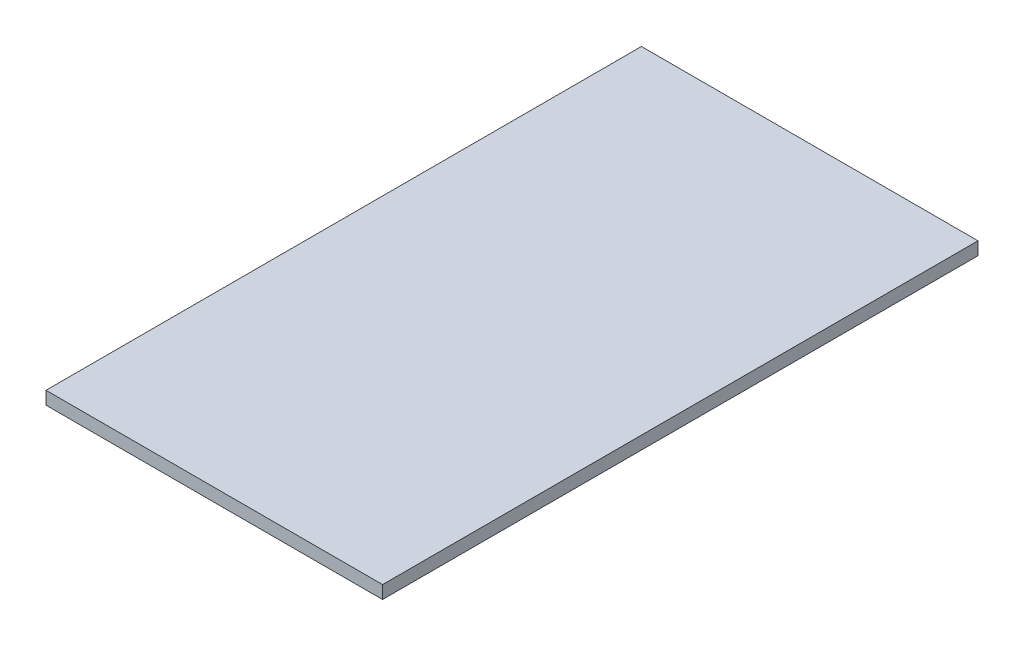
ISO-10303-21;
HEADER;
FILE_DESCRIPTION(('STEP AP214'),'2;1');
FILE_NAME('part.step','',(''),(''),'','','');
FILE_SCHEMA(('AUTOMOTIVE_DESIGN { 1 0 10303 214 1 1 1 1 }'));
ENDSEC;
DATA;
#1=APPLICATION_CONTEXT('core data for automotive mechanical design processes');
#2=APPLICATION_PROTOCOL_DEFINITION('international standard','automotive_design',2000,#1);
#3=PRODUCT_CONTEXT('',#1,'mechanical');
#4=PRODUCT('Part','Part','',(#3));
#5=PRODUCT_RELATED_PRODUCT_CATEGORY('part','',(#4));
#6=PRODUCT_DEFINITION_FORMATION('','',#4);
#7=PRODUCT_DEFINITION_CONTEXT('part definition',#1,'design');
#8=PRODUCT_DEFINITION('design','',#6,#7);
#9=PRODUCT_DEFINITION_SHAPE('','',#8);
#10=(LENGTH_UNIT() NAMED_UNIT(*) SI_UNIT(.MILLI.,.METRE.));
#11=(NAMED_UNIT(*) PLANE_ANGLE_UNIT() SI_UNIT($,.RADIAN.));
#12=(NAMED_UNIT(*) SI_UNIT($,.STERADIAN.) SOLID_ANGLE_UNIT());
#13=UNCERTAINTY_MEASURE_WITH_UNIT(LENGTH_MEASURE(1.E-05),#10,'distance_accuracy_value','');
#14=(GEOMETRIC_REPRESENTATION_CONTEXT(3) GLOBAL_UNCERTAINTY_ASSIGNED_CONTEXT((#13)) GLOBAL_UNIT_ASSIGNED_CONTEXT((#10,
#11,#12)) REPRESENTATION_CONTEXT('',''));
#15=CARTESIAN_POINT('',(0.,0.,0.));
#16=DIRECTION('',(0.,0.,1.));
#17=DIRECTION('',(1.,0.,0.));
#18=AXIS2_PLACEMENT_3D('',#15,#16,#17);
#19=CARTESIAN_POINT('',(-165.1,12.7,292.1));
#20=DIRECTION('',(1.,0.,0.));
#21=DIRECTION('',(0.,0.,-1.));
#22=AXIS2_PLACEMENT_3D('',#19,#20,#21);
#23=PLANE('',#22);
#24=DIRECTION('',(0.,0.,1.));
#25=VECTOR('',#24,1.);
#26=CARTESIAN_POINT('',(-165.1,0.,292.1));
#27=LINE('',#26,#25);
#28=CARTESIAN_POINT('',(-165.1,0.,-292.1));
#29=VERTEX_POINT('',#28);
#30=CARTESIAN_POINT('',(-165.1,0.,292.1));
#31=VERTEX_POINT('',#30);
#32=EDGE_CURVE('E102',#29,#31,#27,.T.);
#33=ORIENTED_EDGE('',*,*,#32,.T.);
#34=DIRECTION('',(0.,-1.,0.));
#35=VECTOR('',#34,1.);
#36=CARTESIAN_POINT('',(-165.1,12.7,292.1));
#37=LINE('',#36,#35);
#38=CARTESIAN_POINT('',(-165.1,12.7,292.1));
#39=VERTEX_POINT('',#38);
#40=EDGE_CURVE('E11',#39,#31,#37,.T.);
#41=ORIENTED_EDGE('',*,*,#40,.F.);
#42=DIRECTION('',(0.,0.,1.));
#43=VECTOR('',#42,1.);
#44=CARTESIAN_POINT('',(-165.1,12.7,292.1));
#45=LINE('',#44,#43);
#46=CARTESIAN_POINT('',(-165.1,12.7,-292.1));
#47=VERTEX_POINT('',#46);
#48=EDGE_CURVE('E89',#47,#39,#45,.T.);
#49=ORIENTED_EDGE('',*,*,#48,.F.);
#50=DIRECTION('',(0.,-1.,0.));
#51=VECTOR('',#50,1.);
#52=CARTESIAN_POINT('',(-165.1,12.7,-292.1));
#53=LINE('',#52,#51);
#54=EDGE_CURVE('E98',#47,#29,#53,.T.);
#55=ORIENTED_EDGE('',*,*,#54,.T.);
#56=EDGE_LOOP('',(#33,#41,#49,#55));
#57=FACE_BOUND('',#56,.T.);
#58=ADVANCED_FACE('F38',(#57),#23,.F.);
#59=CARTESIAN_POINT('',(165.1,12.7,292.1));
#60=DIRECTION('',(0.,0.,-1.));
#61=DIRECTION('',(-1.,0.,0.));
#62=AXIS2_PLACEMENT_3D('',#59,#60,#61);
#63=PLANE('',#62);
#64=DIRECTION('',(1.,0.,0.));
#65=VECTOR('',#64,1.);
#66=CARTESIAN_POINT('',(165.1,0.,292.1));
#67=LINE('',#66,#65);
#68=CARTESIAN_POINT('',(165.1,0.,292.1));
#69=VERTEX_POINT('',#68);
#70=EDGE_CURVE('E94',#31,#69,#67,.T.);
#71=ORIENTED_EDGE('',*,*,#70,.T.);
#72=DIRECTION('',(0.,-1.,0.));
#73=VECTOR('',#72,1.);
#74=CARTESIAN_POINT('',(165.1,12.7,292.1));
#75=LINE('',#74,#73);
#76=CARTESIAN_POINT('',(165.1,12.7,292.1));
#77=VERTEX_POINT('',#76);
#78=EDGE_CURVE('E46',#77,#69,#75,.T.);
#79=ORIENTED_EDGE('',*,*,#78,.F.);
#80=DIRECTION('',(1.,0.,0.));
#81=VECTOR('',#80,1.);
#82=CARTESIAN_POINT('',(165.1,12.7,292.1));
#83=LINE('',#82,#81);
#84=EDGE_CURVE('E84',#39,#77,#83,.T.);
#85=ORIENTED_EDGE('',*,*,#84,.F.);
#86=ORIENTED_EDGE('',*,*,#40,.T.);
#87=EDGE_LOOP('',(#71,#79,#85,#86));
#88=FACE_BOUND('',#87,.T.);
#89=ADVANCED_FACE('F93',(#88),#63,.F.);
#90=CARTESIAN_POINT('',(165.1,12.7,292.1));
#91=DIRECTION('',(-1.,0.,0.));
#92=DIRECTION('',(0.,0.,1.));
#93=AXIS2_PLACEMENT_3D('',#90,#91,#92);
#94=PLANE('',#93);
#95=DIRECTION('',(0.,0.,-1.));
#96=VECTOR('',#95,1.);
#97=CARTESIAN_POINT('',(165.1,0.,292.1));
#98=LINE('',#97,#96);
#99=CARTESIAN_POINT('',(165.1,0.,-292.1));
#100=VERTEX_POINT('',#99);
#101=EDGE_CURVE('E71',#69,#100,#98,.T.);
#102=ORIENTED_EDGE('',*,*,#101,.T.);
#103=DIRECTION('',(0.,-1.,0.));
#104=VECTOR('',#103,1.);
#105=CARTESIAN_POINT('',(165.1,12.7,-292.1));
#106=LINE('',#105,#104);
#107=CARTESIAN_POINT('',(165.1,12.7,-292.1));
#108=VERTEX_POINT('',#107);
#109=EDGE_CURVE('E95',#108,#100,#106,.T.);
#110=ORIENTED_EDGE('',*,*,#109,.F.);
#111=DIRECTION('',(0.,0.,-1.));
#112=VECTOR('',#111,1.);
#113=CARTESIAN_POINT('',(165.1,12.7,292.1));
#114=LINE('',#113,#112);
#115=EDGE_CURVE('E87',#77,#108,#114,.T.);
#116=ORIENTED_EDGE('',*,*,#115,.F.);
#117=ORIENTED_EDGE('',*,*,#78,.T.);
#118=EDGE_LOOP('',(#102,#110,#116,#117));
#119=FACE_BOUND('',#118,.T.);
#120=ADVANCED_FACE('F96',(#119),#94,.F.);
#121=CARTESIAN_POINT('',(165.1,12.7,-292.1));
#122=DIRECTION('',(0.,0.,1.));
#123=DIRECTION('',(1.,0.,0.));
#124=AXIS2_PLACEMENT_3D('',#121,#122,#123);
#125=PLANE('',#124);
#126=DIRECTION('',(-1.,0.,0.));
#127=VECTOR('',#126,1.);
#128=CARTESIAN_POINT('',(165.1,0.,-292.1));
#129=LINE('',#128,#127);
#130=EDGE_CURVE('E77',#100,#29,#129,.T.);
#131=ORIENTED_EDGE('',*,*,#130,.T.);
#132=ORIENTED_EDGE('',*,*,#54,.F.);
#133=DIRECTION('',(-1.,0.,0.));
#134=VECTOR('',#133,1.);
#135=CARTESIAN_POINT('',(165.1,12.7,-292.1));
#136=LINE('',#135,#134);
#137=EDGE_CURVE('E54',#108,#47,#136,.T.);
#138=ORIENTED_EDGE('',*,*,#137,.F.);
#139=ORIENTED_EDGE('',*,*,#109,.T.);
#140=EDGE_LOOP('',(#131,#132,#138,#139));
#141=FACE_BOUND('',#140,.T.);
#142=ADVANCED_FACE('F110',(#141),#125,.F.);
#143=CARTESIAN_POINT('',(-165.1,12.7,-292.1));
#144=DIRECTION('',(0.,1.,0.));
#145=DIRECTION('',(0.,0.,1.));
#146=AXIS2_PLACEMENT_3D('',#143,#144,#145);
#147=PLANE('',#146);
#148=ORIENTED_EDGE('',*,*,#48,.T.);
#149=ORIENTED_EDGE('',*,*,#84,.T.);
#150=ORIENTED_EDGE('',*,*,#115,.T.);
#151=ORIENTED_EDGE('',*,*,#137,.T.);
#152=EDGE_LOOP('',(#148,#149,#150,#151));
#153=FACE_BOUND('',#152,.T.);
#154=ADVANCED_FACE('F85',(#153),#147,.T.);
#155=CARTESIAN_POINT('',(-165.1,0.,-292.1));
#156=DIRECTION('',(0.,1.,0.));
#157=DIRECTION('',(0.,0.,1.));
#158=AXIS2_PLACEMENT_3D('',#155,#156,#157);
#159=PLANE('',#158);
#160=ORIENTED_EDGE('',*,*,#32,.F.);
#161=ORIENTED_EDGE('',*,*,#130,.F.);
#162=ORIENTED_EDGE('',*,*,#101,.F.);
#163=ORIENTED_EDGE('',*,*,#70,.F.);
#164=EDGE_LOOP('',(#160,#161,#162,#163));
#165=FACE_BOUND('',#164,.T.);
#166=ADVANCED_FACE('F113',(#165),#159,.F.);
#167=CLOSED_SHELL('',(#58,#89,#120,#142,#154,#166));
#168=MANIFOLD_SOLID_BREP('B2',#167);
#169=ADVANCED_BREP_SHAPE_REPRESENTATION('',(#18,#168),#14);
#170=SHAPE_DEFINITION_REPRESENTATION(#9,#169);
ENDSEC;
END-ISO-10303-21;
